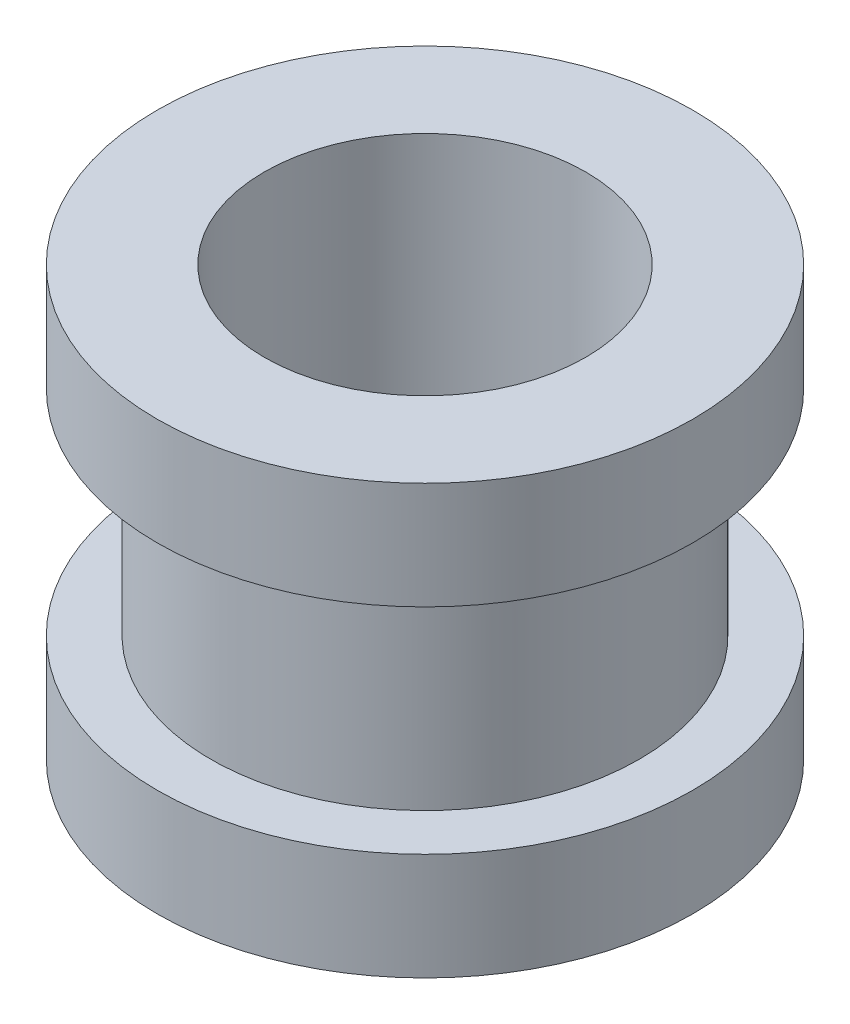
ISO-10303-21;
HEADER;
FILE_DESCRIPTION(('STEP AP214'),'2;1');
FILE_NAME('part.step','',(''),(''),'','','');
FILE_SCHEMA(('AUTOMOTIVE_DESIGN { 1 0 10303 214 1 1 1 1 }'));
ENDSEC;
DATA;
#1=APPLICATION_CONTEXT('core data for automotive mechanical design processes');
#2=APPLICATION_PROTOCOL_DEFINITION('international standard','automotive_design',2000,#1);
#3=PRODUCT_CONTEXT('',#1,'mechanical');
#4=PRODUCT('Part','Part','',(#3));
#5=PRODUCT_RELATED_PRODUCT_CATEGORY('part','',(#4));
#6=PRODUCT_DEFINITION_FORMATION('','',#4);
#7=PRODUCT_DEFINITION_CONTEXT('part definition',#1,'design');
#8=PRODUCT_DEFINITION('design','',#6,#7);
#9=PRODUCT_DEFINITION_SHAPE('','',#8);
#10=(LENGTH_UNIT() NAMED_UNIT(*) SI_UNIT(.MILLI.,.METRE.));
#11=(NAMED_UNIT(*) PLANE_ANGLE_UNIT() SI_UNIT($,.RADIAN.));
#12=(NAMED_UNIT(*) SI_UNIT($,.STERADIAN.) SOLID_ANGLE_UNIT());
#13=UNCERTAINTY_MEASURE_WITH_UNIT(LENGTH_MEASURE(1.E-05),#10,'distance_accuracy_value','');
#14=(GEOMETRIC_REPRESENTATION_CONTEXT(3) GLOBAL_UNCERTAINTY_ASSIGNED_CONTEXT((#13)) GLOBAL_UNIT_ASSIGNED_CONTEXT((#10,
#11,#12)) REPRESENTATION_CONTEXT('',''));
#15=CARTESIAN_POINT('',(0.,0.,0.));
#16=DIRECTION('',(0.,0.,1.));
#17=DIRECTION('',(1.,0.,0.));
#18=AXIS2_PLACEMENT_3D('',#15,#16,#17);
#19=CARTESIAN_POINT('',(0.,2.,0.));
#20=DIRECTION('',(0.,1.,0.));
#21=DIRECTION('',(-1.,0.,0.));
#22=AXIS2_PLACEMENT_3D('',#19,#20,#21);
#23=PLANE('',#22);
#24=CARTESIAN_POINT('',(0.,2.,0.));
#25=DIRECTION('',(0.,1.,0.));
#26=DIRECTION('',(-1.,0.,0.));
#27=AXIS2_PLACEMENT_3D('',#24,#25,#26);
#28=CIRCLE('',#27,1.5);
#29=CARTESIAN_POINT('',(-1.5,2.,0.));
#30=VERTEX_POINT('',#29);
#31=EDGE_CURVE('E69',#30,#30,#28,.T.);
#32=ORIENTED_EDGE('',*,*,#31,.F.);
#33=EDGE_LOOP('',(#32));
#34=FACE_BOUND('',#33,.T.);
#35=CARTESIAN_POINT('',(0.,2.,0.));
#36=DIRECTION('',(0.,1.,0.));
#37=DIRECTION('',(-1.,0.,0.));
#38=AXIS2_PLACEMENT_3D('',#35,#36,#37);
#39=CIRCLE('',#38,2.5);
#40=CARTESIAN_POINT('',(-2.5,2.,0.));
#41=VERTEX_POINT('',#40);
#42=EDGE_CURVE('E10',#41,#41,#39,.T.);
#43=ORIENTED_EDGE('',*,*,#42,.T.);
#44=EDGE_LOOP('',(#43));
#45=FACE_BOUND('',#44,.T.);
#46=ADVANCED_FACE('F37',(#34,#45),#23,.T.);
#47=CARTESIAN_POINT('',(0.,2.,0.));
#48=DIRECTION('',(0.,1.,0.));
#49=DIRECTION('',(-1.,0.,0.));
#50=AXIS2_PLACEMENT_3D('',#47,#48,#49);
#51=CYLINDRICAL_SURFACE('',#50,2.5);
#52=CARTESIAN_POINT('',(0.,0.999999999999999,0.));
#53=DIRECTION('',(0.,1.,0.));
#54=DIRECTION('',(-1.,0.,0.));
#55=AXIS2_PLACEMENT_3D('',#52,#53,#54);
#56=CIRCLE('',#55,2.5);
#57=CARTESIAN_POINT('',(-2.5,1.,0.));
#58=VERTEX_POINT('',#57);
#59=EDGE_CURVE('E44',#58,#58,#56,.T.);
#60=ORIENTED_EDGE('',*,*,#59,.T.);
#61=EDGE_LOOP('',(#60));
#62=FACE_BOUND('',#61,.T.);
#63=ORIENTED_EDGE('',*,*,#42,.F.);
#64=EDGE_LOOP('',(#63));
#65=FACE_BOUND('',#64,.T.);
#66=ADVANCED_FACE('F88',(#62,#65),#51,.T.);
#67=CARTESIAN_POINT('',(-2.5,1.,0.));
#68=DIRECTION('',(0.,-1.,0.));
#69=DIRECTION('',(1.,0.,0.));
#70=AXIS2_PLACEMENT_3D('',#67,#68,#69);
#71=PLANE('',#70);
#72=CARTESIAN_POINT('',(0.,0.999999999999999,0.));
#73=DIRECTION('',(0.,1.,0.));
#74=DIRECTION('',(-1.,0.,0.));
#75=AXIS2_PLACEMENT_3D('',#72,#73,#74);
#76=CIRCLE('',#75,2.);
#77=CARTESIAN_POINT('',(-2.,1.,0.));
#78=VERTEX_POINT('',#77);
#79=EDGE_CURVE('E49',#78,#78,#76,.T.);
#80=ORIENTED_EDGE('',*,*,#79,.T.);
#81=EDGE_LOOP('',(#80));
#82=FACE_BOUND('',#81,.T.);
#83=ORIENTED_EDGE('',*,*,#59,.F.);
#84=EDGE_LOOP('',(#83));
#85=FACE_BOUND('',#84,.T.);
#86=ADVANCED_FACE('F92',(#82,#85),#71,.T.);
#87=CARTESIAN_POINT('',(0.,2.,0.));
#88=DIRECTION('',(0.,1.,0.));
#89=DIRECTION('',(-1.,0.,0.));
#90=AXIS2_PLACEMENT_3D('',#87,#88,#89);
#91=CYLINDRICAL_SURFACE('',#90,2.);
#92=ORIENTED_EDGE('',*,*,#79,.F.);
#93=EDGE_LOOP('',(#92));
#94=FACE_BOUND('',#93,.T.);
#95=CARTESIAN_POINT('',(0.,-0.999999999999999,0.));
#96=DIRECTION('',(0.,1.,0.));
#97=DIRECTION('',(-1.,0.,0.));
#98=AXIS2_PLACEMENT_3D('',#95,#96,#97);
#99=CIRCLE('',#98,2.);
#100=CARTESIAN_POINT('',(-2.,-0.999999999999999,0.));
#101=VERTEX_POINT('',#100);
#102=EDGE_CURVE('E64',#101,#101,#99,.T.);
#103=ORIENTED_EDGE('',*,*,#102,.T.);
#104=EDGE_LOOP('',(#103));
#105=FACE_BOUND('',#104,.T.);
#106=ADVANCED_FACE('F96',(#94,#105),#91,.T.);
#107=CARTESIAN_POINT('',(0.,-2.,0.));
#108=DIRECTION('',(0.,-1.,0.));
#109=DIRECTION('',(-1.,0.,0.));
#110=AXIS2_PLACEMENT_3D('',#107,#108,#109);
#111=PLANE('',#110);
#112=CARTESIAN_POINT('',(0.,-2.,0.));
#113=DIRECTION('',(0.,1.,0.));
#114=DIRECTION('',(-1.,0.,0.));
#115=AXIS2_PLACEMENT_3D('',#112,#113,#114);
#116=CIRCLE('',#115,1.5);
#117=CARTESIAN_POINT('',(-1.5,-2.,0.));
#118=VERTEX_POINT('',#117);
#119=EDGE_CURVE('E68',#118,#118,#116,.T.);
#120=ORIENTED_EDGE('',*,*,#119,.T.);
#121=EDGE_LOOP('',(#120));
#122=FACE_BOUND('',#121,.T.);
#123=CARTESIAN_POINT('',(0.,-2.,0.));
#124=DIRECTION('',(0.,1.,0.));
#125=DIRECTION('',(-1.,0.,0.));
#126=AXIS2_PLACEMENT_3D('',#123,#124,#125);
#127=CIRCLE('',#126,2.5);
#128=CARTESIAN_POINT('',(-2.5,-2.,0.));
#129=VERTEX_POINT('',#128);
#130=EDGE_CURVE('E54',#129,#129,#127,.T.);
#131=ORIENTED_EDGE('',*,*,#130,.F.);
#132=EDGE_LOOP('',(#131));
#133=FACE_BOUND('',#132,.T.);
#134=ADVANCED_FACE('F77',(#122,#133),#111,.T.);
#135=CARTESIAN_POINT('',(0.,-2.,0.));
#136=DIRECTION('',(0.,-1.,0.));
#137=DIRECTION('',(-1.,0.,0.));
#138=AXIS2_PLACEMENT_3D('',#135,#136,#137);
#139=CYLINDRICAL_SURFACE('',#138,2.5);
#140=CARTESIAN_POINT('',(0.,-0.999999999999999,0.));
#141=DIRECTION('',(0.,1.,0.));
#142=DIRECTION('',(-1.,0.,0.));
#143=AXIS2_PLACEMENT_3D('',#140,#141,#142);
#144=CIRCLE('',#143,2.5);
#145=CARTESIAN_POINT('',(-2.5,-0.999999999999999,0.));
#146=VERTEX_POINT('',#145);
#147=EDGE_CURVE('E60',#146,#146,#144,.T.);
#148=ORIENTED_EDGE('',*,*,#147,.F.);
#149=EDGE_LOOP('',(#148));
#150=FACE_BOUND('',#149,.T.);
#151=ORIENTED_EDGE('',*,*,#130,.T.);
#152=EDGE_LOOP('',(#151));
#153=FACE_BOUND('',#152,.T.);
#154=ADVANCED_FACE('F106',(#150,#153),#139,.T.);
#155=CARTESIAN_POINT('',(-2.5,-0.999999999999999,0.));
#156=DIRECTION('',(0.,1.,0.));
#157=DIRECTION('',(1.,0.,0.));
#158=AXIS2_PLACEMENT_3D('',#155,#156,#157);
#159=PLANE('',#158);
#160=ORIENTED_EDGE('',*,*,#102,.F.);
#161=EDGE_LOOP('',(#160));
#162=FACE_BOUND('',#161,.T.);
#163=ORIENTED_EDGE('',*,*,#147,.T.);
#164=EDGE_LOOP('',(#163));
#165=FACE_BOUND('',#164,.T.);
#166=ADVANCED_FACE('F83',(#162,#165),#159,.T.);
#167=CARTESIAN_POINT('',(0.,-2.,0.));
#168=DIRECTION('',(0.,1.,0.));
#169=DIRECTION('',(-1.,0.,0.));
#170=AXIS2_PLACEMENT_3D('',#167,#168,#169);
#171=CYLINDRICAL_SURFACE('',#170,1.5);
#172=ORIENTED_EDGE('',*,*,#119,.F.);
#173=EDGE_LOOP('',(#172));
#174=FACE_BOUND('',#173,.T.);
#175=ORIENTED_EDGE('',*,*,#31,.T.);
#176=EDGE_LOOP('',(#175));
#177=FACE_BOUND('',#176,.T.);
#178=ADVANCED_FACE('F80',(#174,#177),#171,.F.);
#179=CLOSED_SHELL('',(#46,#66,#86,#106,#134,#154,#166,#178));
#180=MANIFOLD_SOLID_BREP('B2',#179);
#181=ADVANCED_BREP_SHAPE_REPRESENTATION('',(#18,#180),#14);
#182=SHAPE_DEFINITION_REPRESENTATION(#9,#181);
ENDSEC;
END-ISO-10303-21;
